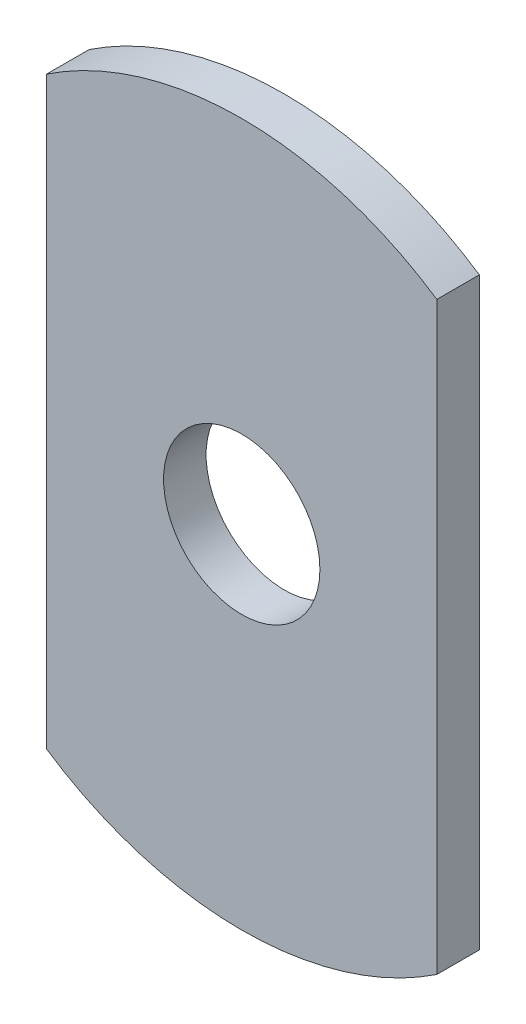
ISO-10303-21;
HEADER;
FILE_DESCRIPTION(('STEP AP214'),'2;1');
FILE_NAME('part.step','',(''),(''),'','','');
FILE_SCHEMA(('AUTOMOTIVE_DESIGN { 1 0 10303 214 1 1 1 1 }'));
ENDSEC;
DATA;
#1=APPLICATION_CONTEXT('core data for automotive mechanical design processes');
#2=APPLICATION_PROTOCOL_DEFINITION('international standard','automotive_design',2000,#1);
#3=PRODUCT_CONTEXT('',#1,'mechanical');
#4=PRODUCT('Part','Part','',(#3));
#5=PRODUCT_RELATED_PRODUCT_CATEGORY('part','',(#4));
#6=PRODUCT_DEFINITION_FORMATION('','',#4);
#7=PRODUCT_DEFINITION_CONTEXT('part definition',#1,'design');
#8=PRODUCT_DEFINITION('design','',#6,#7);
#9=PRODUCT_DEFINITION_SHAPE('','',#8);
#10=(LENGTH_UNIT() NAMED_UNIT(*) SI_UNIT(.MILLI.,.METRE.));
#11=(NAMED_UNIT(*) PLANE_ANGLE_UNIT() SI_UNIT($,.RADIAN.));
#12=(NAMED_UNIT(*) SI_UNIT($,.STERADIAN.) SOLID_ANGLE_UNIT());
#13=UNCERTAINTY_MEASURE_WITH_UNIT(LENGTH_MEASURE(1.E-05),#10,'distance_accuracy_value','');
#14=(GEOMETRIC_REPRESENTATION_CONTEXT(3) GLOBAL_UNCERTAINTY_ASSIGNED_CONTEXT((#13)) GLOBAL_UNIT_ASSIGNED_CONTEXT((#10,
#11,#12)) REPRESENTATION_CONTEXT('',''));
#15=CARTESIAN_POINT('',(0.,0.,0.));
#16=DIRECTION('',(0.,0.,1.));
#17=DIRECTION('',(1.,0.,0.));
#18=AXIS2_PLACEMENT_3D('',#15,#16,#17);
#19=CARTESIAN_POINT('',(0.,0.,-0.8636));
#20=DIRECTION('',(0.,0.,1.));
#21=DIRECTION('',(1.,0.,0.));
#22=AXIS2_PLACEMENT_3D('',#19,#20,#21);
#23=CYLINDRICAL_SURFACE('',#22,7.1374);
#24=CARTESIAN_POINT('',(0.,0.,0.));
#25=DIRECTION('',(0.,0.,1.));
#26=DIRECTION('',(1.,0.,0.));
#27=AXIS2_PLACEMENT_3D('',#24,#25,#26);
#28=CIRCLE('',#27,7.1374);
#29=CARTESIAN_POINT('',(-3.9624,-5.93648591340028,0.));
#30=VERTEX_POINT('',#29);
#31=CARTESIAN_POINT('',(3.9624,-5.93648591340028,0.));
#32=VERTEX_POINT('',#31);
#33=EDGE_CURVE('E96',#30,#32,#28,.T.);
#34=ORIENTED_EDGE('',*,*,#33,.F.);
#35=DIRECTION('',(0.,0.,1.));
#36=VECTOR('',#35,1.);
#37=CARTESIAN_POINT('',(-3.9624,-5.93648591340028,-0.8636));
#38=LINE('',#37,#36);
#39=CARTESIAN_POINT('',(-3.9624,-5.93648591340028,-0.8636));
#40=VERTEX_POINT('',#39);
#41=EDGE_CURVE('E11',#40,#30,#38,.T.);
#42=ORIENTED_EDGE('',*,*,#41,.F.);
#43=CARTESIAN_POINT('',(0.,0.,-0.8636));
#44=DIRECTION('',(0.,0.,1.));
#45=DIRECTION('',(1.,0.,0.));
#46=AXIS2_PLACEMENT_3D('',#43,#44,#45);
#47=CIRCLE('',#46,7.1374);
#48=CARTESIAN_POINT('',(3.9624,-5.93648591340028,-0.8636));
#49=VERTEX_POINT('',#48);
#50=EDGE_CURVE('E89',#40,#49,#47,.T.);
#51=ORIENTED_EDGE('',*,*,#50,.T.);
#52=DIRECTION('',(0.,0.,1.));
#53=VECTOR('',#52,1.);
#54=CARTESIAN_POINT('',(3.9624,-5.93648591340028,-0.8636));
#55=LINE('',#54,#53);
#56=EDGE_CURVE('E34',#49,#32,#55,.T.);
#57=ORIENTED_EDGE('',*,*,#56,.T.);
#58=EDGE_LOOP('',(#34,#42,#51,#57));
#59=FACE_BOUND('',#58,.T.);
#60=ADVANCED_FACE('F31',(#59),#23,.T.);
#61=CARTESIAN_POINT('',(-3.9624,5.93648591340028,-0.8636));
#62=DIRECTION('',(-1.,0.,0.));
#63=DIRECTION('',(0.,0.,1.));
#64=AXIS2_PLACEMENT_3D('',#61,#62,#63);
#65=PLANE('',#64);
#66=DIRECTION('',(0.,-1.,0.));
#67=VECTOR('',#66,1.);
#68=CARTESIAN_POINT('',(-3.9624,5.93648591340028,0.));
#69=LINE('',#68,#67);
#70=CARTESIAN_POINT('',(-3.9624,5.93648591340028,0.));
#71=VERTEX_POINT('',#70);
#72=EDGE_CURVE('E91',#71,#30,#69,.T.);
#73=ORIENTED_EDGE('',*,*,#72,.F.);
#74=DIRECTION('',(0.,0.,1.));
#75=VECTOR('',#74,1.);
#76=CARTESIAN_POINT('',(-3.9624,5.93648591340028,-0.8636));
#77=LINE('',#76,#75);
#78=CARTESIAN_POINT('',(-3.9624,5.93648591340028,-0.8636));
#79=VERTEX_POINT('',#78);
#80=EDGE_CURVE('E40',#79,#71,#77,.T.);
#81=ORIENTED_EDGE('',*,*,#80,.F.);
#82=DIRECTION('',(0.,-1.,0.));
#83=VECTOR('',#82,1.);
#84=CARTESIAN_POINT('',(-3.9624,5.93648591340028,-0.8636));
#85=LINE('',#84,#83);
#86=EDGE_CURVE('E86',#79,#40,#85,.T.);
#87=ORIENTED_EDGE('',*,*,#86,.T.);
#88=ORIENTED_EDGE('',*,*,#41,.T.);
#89=EDGE_LOOP('',(#73,#81,#87,#88));
#90=FACE_BOUND('',#89,.T.);
#91=ADVANCED_FACE('F107',(#90),#65,.T.);
#92=CARTESIAN_POINT('',(0.,0.,-0.8636));
#93=DIRECTION('',(0.,0.,1.));
#94=DIRECTION('',(1.,0.,0.));
#95=AXIS2_PLACEMENT_3D('',#92,#93,#94);
#96=CYLINDRICAL_SURFACE('',#95,7.1374);
#97=CARTESIAN_POINT('',(0.,0.,0.));
#98=DIRECTION('',(0.,0.,1.));
#99=DIRECTION('',(1.,0.,0.));
#100=AXIS2_PLACEMENT_3D('',#97,#98,#99);
#101=CIRCLE('',#100,7.1374);
#102=CARTESIAN_POINT('',(3.9624,5.93648591340028,0.));
#103=VERTEX_POINT('',#102);
#104=EDGE_CURVE('E81',#103,#71,#101,.T.);
#105=ORIENTED_EDGE('',*,*,#104,.F.);
#106=DIRECTION('',(0.,0.,1.));
#107=VECTOR('',#106,1.);
#108=CARTESIAN_POINT('',(3.9624,5.93648591340028,-0.8636));
#109=LINE('',#108,#107);
#110=CARTESIAN_POINT('',(3.9624,5.93648591340028,-0.8636));
#111=VERTEX_POINT('',#110);
#112=EDGE_CURVE('E76',#111,#103,#109,.T.);
#113=ORIENTED_EDGE('',*,*,#112,.F.);
#114=CARTESIAN_POINT('',(0.,0.,-0.8636));
#115=DIRECTION('',(0.,0.,1.));
#116=DIRECTION('',(1.,0.,0.));
#117=AXIS2_PLACEMENT_3D('',#114,#115,#116);
#118=CIRCLE('',#117,7.1374);
#119=EDGE_CURVE('E79',#111,#79,#118,.T.);
#120=ORIENTED_EDGE('',*,*,#119,.T.);
#121=ORIENTED_EDGE('',*,*,#80,.T.);
#122=EDGE_LOOP('',(#105,#113,#120,#121));
#123=FACE_BOUND('',#122,.T.);
#124=ADVANCED_FACE('F78',(#123),#96,.T.);
#125=CARTESIAN_POINT('',(3.9624,5.93648591340028,-0.8636));
#126=DIRECTION('',(1.,0.,0.));
#127=DIRECTION('',(0.,0.,-1.));
#128=AXIS2_PLACEMENT_3D('',#125,#126,#127);
#129=PLANE('',#128);
#130=DIRECTION('',(0.,1.,0.));
#131=VECTOR('',#130,1.);
#132=CARTESIAN_POINT('',(3.9624,5.93648591340028,0.));
#133=LINE('',#132,#131);
#134=EDGE_CURVE('E99',#32,#103,#133,.T.);
#135=ORIENTED_EDGE('',*,*,#134,.F.);
#136=ORIENTED_EDGE('',*,*,#56,.F.);
#137=DIRECTION('',(0.,1.,0.));
#138=VECTOR('',#137,1.);
#139=CARTESIAN_POINT('',(3.9624,5.93648591340028,-0.8636));
#140=LINE('',#139,#138);
#141=EDGE_CURVE('E85',#49,#111,#140,.T.);
#142=ORIENTED_EDGE('',*,*,#141,.T.);
#143=ORIENTED_EDGE('',*,*,#112,.T.);
#144=EDGE_LOOP('',(#135,#136,#142,#143));
#145=FACE_BOUND('',#144,.T.);
#146=ADVANCED_FACE('F88',(#145),#129,.T.);
#147=CARTESIAN_POINT('',(0.,0.,-0.8636));
#148=DIRECTION('',(0.,0.,1.));
#149=DIRECTION('',(1.,0.,0.));
#150=AXIS2_PLACEMENT_3D('',#147,#148,#149);
#151=PLANE('',#150);
#152=CARTESIAN_POINT('',(0.,0.,-0.8636));
#153=DIRECTION('',(0.,0.,1.));
#154=DIRECTION('',(1.,0.,0.));
#155=AXIS2_PLACEMENT_3D('',#152,#153,#154);
#156=CIRCLE('',#155,1.5875);
#157=CARTESIAN_POINT('',(1.5875,0.,-0.8636));
#158=VERTEX_POINT('',#157);
#159=EDGE_CURVE('E100',#158,#158,#156,.T.);
#160=ORIENTED_EDGE('',*,*,#159,.T.);
#161=EDGE_LOOP('',(#160));
#162=FACE_BOUND('',#161,.T.);
#163=ORIENTED_EDGE('',*,*,#50,.F.);
#164=ORIENTED_EDGE('',*,*,#86,.F.);
#165=ORIENTED_EDGE('',*,*,#119,.F.);
#166=ORIENTED_EDGE('',*,*,#141,.F.);
#167=EDGE_LOOP('',(#163,#164,#165,#166));
#168=FACE_BOUND('',#167,.T.);
#169=ADVANCED_FACE('F84',(#162,#168),#151,.F.);
#170=CARTESIAN_POINT('',(0.,0.,0.));
#171=DIRECTION('',(0.,0.,1.));
#172=DIRECTION('',(1.,0.,0.));
#173=AXIS2_PLACEMENT_3D('',#170,#171,#172);
#174=PLANE('',#173);
#175=CARTESIAN_POINT('',(0.,0.,0.));
#176=DIRECTION('',(0.,0.,1.));
#177=DIRECTION('',(1.,0.,0.));
#178=AXIS2_PLACEMENT_3D('',#175,#176,#177);
#179=CIRCLE('',#178,1.5875);
#180=CARTESIAN_POINT('',(1.5875,0.,0.));
#181=VERTEX_POINT('',#180);
#182=EDGE_CURVE('E137',#181,#181,#179,.T.);
#183=ORIENTED_EDGE('',*,*,#182,.F.);
#184=EDGE_LOOP('',(#183));
#185=FACE_BOUND('',#184,.T.);
#186=ORIENTED_EDGE('',*,*,#33,.T.);
#187=ORIENTED_EDGE('',*,*,#134,.T.);
#188=ORIENTED_EDGE('',*,*,#104,.T.);
#189=ORIENTED_EDGE('',*,*,#72,.T.);
#190=EDGE_LOOP('',(#186,#187,#188,#189));
#191=FACE_BOUND('',#190,.T.);
#192=ADVANCED_FACE('F106',(#185,#191),#174,.T.);
#193=CARTESIAN_POINT('',(0.,0.,-0.8636));
#194=DIRECTION('',(0.,0.,1.));
#195=DIRECTION('',(1.,0.,0.));
#196=AXIS2_PLACEMENT_3D('',#193,#194,#195);
#197=CYLINDRICAL_SURFACE('',#196,1.5875);
#198=ORIENTED_EDGE('',*,*,#159,.F.);
#199=EDGE_LOOP('',(#198));
#200=FACE_BOUND('',#199,.T.);
#201=ORIENTED_EDGE('',*,*,#182,.T.);
#202=EDGE_LOOP('',(#201));
#203=FACE_BOUND('',#202,.T.);
#204=ADVANCED_FACE('F125',(#200,#203),#197,.F.);
#205=CLOSED_SHELL('',(#60,#91,#124,#146,#169,#192,#204));
#206=MANIFOLD_SOLID_BREP('B2',#205);
#207=ADVANCED_BREP_SHAPE_REPRESENTATION('',(#18,#206),#14);
#208=SHAPE_DEFINITION_REPRESENTATION(#9,#207);
ENDSEC;
END-ISO-10303-21;
